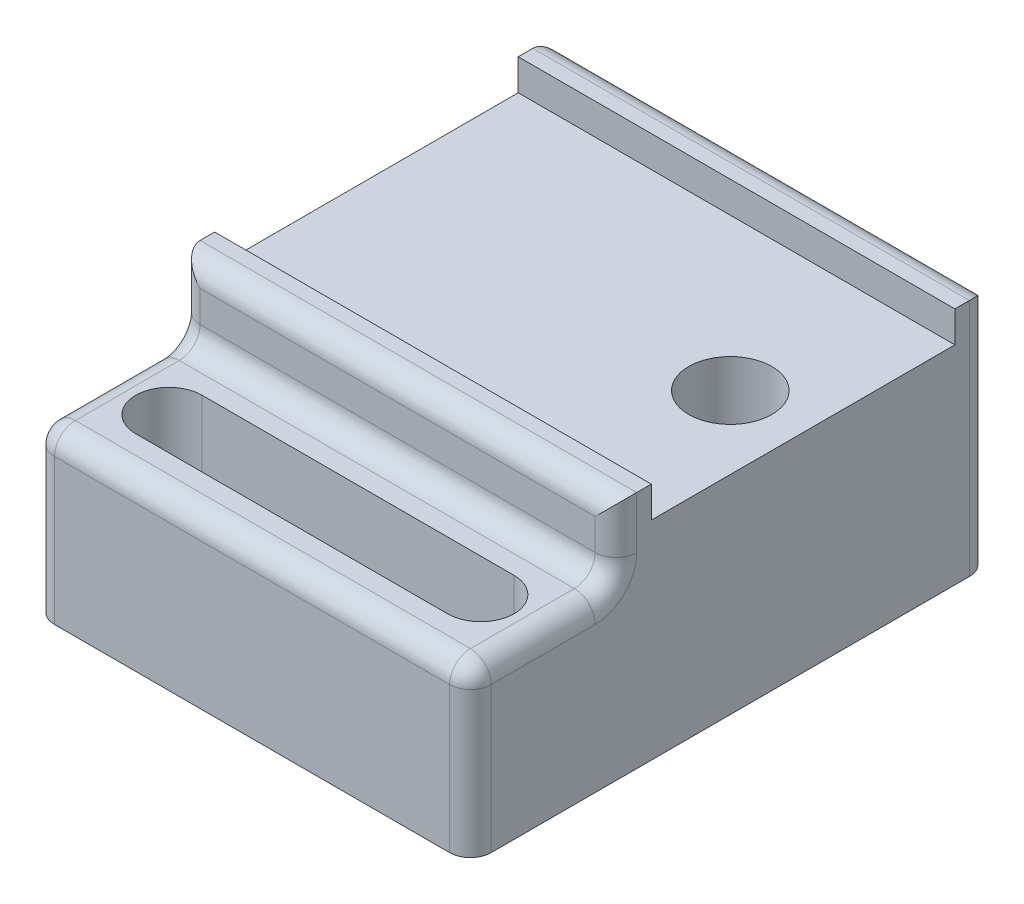
ISO-10303-21;
HEADER;
FILE_DESCRIPTION(('STEP AP214'),'2;1');
FILE_NAME('part.step','',(''),(''),'','','');
FILE_SCHEMA(('AUTOMOTIVE_DESIGN { 1 0 10303 214 1 1 1 1 }'));
ENDSEC;
DATA;
#1=APPLICATION_CONTEXT('core data for automotive mechanical design processes');
#2=APPLICATION_PROTOCOL_DEFINITION('international standard','automotive_design',2000,#1);
#3=PRODUCT_CONTEXT('',#1,'mechanical');
#4=PRODUCT('Part','Part','',(#3));
#5=PRODUCT_RELATED_PRODUCT_CATEGORY('part','',(#4));
#6=PRODUCT_DEFINITION_FORMATION('','',#4);
#7=PRODUCT_DEFINITION_CONTEXT('part definition',#1,'design');
#8=PRODUCT_DEFINITION('design','',#6,#7);
#9=PRODUCT_DEFINITION_SHAPE('','',#8);
#10=(LENGTH_UNIT() NAMED_UNIT(*) SI_UNIT(.MILLI.,.METRE.));
#11=(NAMED_UNIT(*) PLANE_ANGLE_UNIT() SI_UNIT($,.RADIAN.));
#12=(NAMED_UNIT(*) SI_UNIT($,.STERADIAN.) SOLID_ANGLE_UNIT());
#13=UNCERTAINTY_MEASURE_WITH_UNIT(LENGTH_MEASURE(1.E-05),#10,'distance_accuracy_value','');
#14=(GEOMETRIC_REPRESENTATION_CONTEXT(3) GLOBAL_UNCERTAINTY_ASSIGNED_CONTEXT((#13)) GLOBAL_UNIT_ASSIGNED_CONTEXT((#10,
#11,#12)) REPRESENTATION_CONTEXT('',''));
#15=CARTESIAN_POINT('',(0.,0.,0.));
#16=DIRECTION('',(0.,0.,1.));
#17=DIRECTION('',(1.,0.,0.));
#18=AXIS2_PLACEMENT_3D('',#15,#16,#17);
#19=CARTESIAN_POINT('',(0.,11.5,9.));
#20=DIRECTION('',(0.,0.,-1.));
#21=DIRECTION('',(-1.,0.,0.));
#22=AXIS2_PLACEMENT_3D('',#19,#20,#21);
#23=PLANE('',#22);
#24=DIRECTION('',(1.,0.,0.));
#25=VECTOR('',#24,1.);
#26=CARTESIAN_POINT('',(-10.5,10.5,9.));
#27=LINE('',#26,#25);
#28=CARTESIAN_POINT('',(9.5,10.5,9.));
#29=VERTEX_POINT('',#28);
#30=CARTESIAN_POINT('',(-9.5,10.5,9.));
#31=VERTEX_POINT('',#30);
#32=EDGE_CURVE('E309',#29,#31,#27,.F.);
#33=ORIENTED_EDGE('',*,*,#32,.T.);
#34=DIRECTION('',(0.,-1.,0.));
#35=VECTOR('',#34,1.);
#36=CARTESIAN_POINT('',(-9.5,11.5,9.));
#37=LINE('',#36,#35);
#38=CARTESIAN_POINT('',(-9.5,9.,9.));
#39=VERTEX_POINT('',#38);
#40=EDGE_CURVE('E311',#31,#39,#37,.T.);
#41=ORIENTED_EDGE('',*,*,#40,.T.);
#42=DIRECTION('',(-1.,0.,0.));
#43=VECTOR('',#42,1.);
#44=CARTESIAN_POINT('',(0.,9.,9.));
#45=LINE('',#44,#43);
#46=CARTESIAN_POINT('',(9.5,9.,9.));
#47=VERTEX_POINT('',#46);
#48=EDGE_CURVE('E305',#39,#47,#45,.F.);
#49=ORIENTED_EDGE('',*,*,#48,.T.);
#50=DIRECTION('',(0.,-1.,0.));
#51=VECTOR('',#50,1.);
#52=CARTESIAN_POINT('',(9.5,11.5,9.));
#53=LINE('',#52,#51);
#54=EDGE_CURVE('E307',#47,#29,#53,.F.);
#55=ORIENTED_EDGE('',*,*,#54,.T.);
#56=EDGE_LOOP('',(#33,#41,#49,#55));
#57=FACE_BOUND('',#56,.T.);
#58=ADVANCED_FACE('F35',(#57),#23,.F.);
#59=CARTESIAN_POINT('',(10.5,10.,0.));
#60=DIRECTION('',(1.,0.,0.));
#61=DIRECTION('',(0.,0.,-1.));
#62=AXIS2_PLACEMENT_3D('',#59,#60,#61);
#63=PLANE('',#62);
#64=DIRECTION('',(0.,0.,1.));
#65=VECTOR('',#64,1.);
#66=CARTESIAN_POINT('',(10.5,0.,0.));
#67=LINE('',#66,#65);
#68=CARTESIAN_POINT('',(10.5,0.,-8.));
#69=VERTEX_POINT('',#68);
#70=CARTESIAN_POINT('',(10.5,0.,15.));
#71=VERTEX_POINT('',#70);
#72=EDGE_CURVE('E266',#69,#71,#67,.T.);
#73=ORIENTED_EDGE('',*,*,#72,.F.);
#74=DIRECTION('',(0.,-1.,0.));
#75=VECTOR('',#74,1.);
#76=CARTESIAN_POINT('',(10.5,10.,-8.));
#77=LINE('',#76,#75);
#78=CARTESIAN_POINT('',(10.5,11.5,-8.));
#79=VERTEX_POINT('',#78);
#80=EDGE_CURVE('E303',#69,#79,#77,.F.);
#81=ORIENTED_EDGE('',*,*,#80,.T.);
#82=DIRECTION('',(0.,0.,1.));
#83=VECTOR('',#82,1.);
#84=CARTESIAN_POINT('',(10.5,11.5,0.));
#85=LINE('',#84,#83);
#86=CARTESIAN_POINT('',(10.5,11.5,-7.3));
#87=VERTEX_POINT('',#86);
#88=EDGE_CURVE('E237',#79,#87,#85,.T.);
#89=ORIENTED_EDGE('',*,*,#88,.T.);
#90=DIRECTION('',(0.,-1.,0.));
#91=VECTOR('',#90,1.);
#92=CARTESIAN_POINT('',(10.5,11.5,-7.3));
#93=LINE('',#92,#91);
#94=CARTESIAN_POINT('',(10.5,10.,-7.3));
#95=VERTEX_POINT('',#94);
#96=EDGE_CURVE('E244',#87,#95,#93,.T.);
#97=ORIENTED_EDGE('',*,*,#96,.T.);
#98=DIRECTION('',(0.,0.,1.));
#99=VECTOR('',#98,1.);
#100=CARTESIAN_POINT('',(10.5,10.,0.));
#101=LINE('',#100,#99);
#102=CARTESIAN_POINT('',(10.5,10.,7.3));
#103=VERTEX_POINT('',#102);
#104=EDGE_CURVE('E267',#95,#103,#101,.T.);
#105=ORIENTED_EDGE('',*,*,#104,.T.);
#106=DIRECTION('',(0.,-1.,0.));
#107=VECTOR('',#106,1.);
#108=CARTESIAN_POINT('',(10.5,11.5,7.3));
#109=LINE('',#108,#107);
#110=CARTESIAN_POINT('',(10.5,11.5,7.3));
#111=VERTEX_POINT('',#110);
#112=EDGE_CURVE('E264',#111,#103,#109,.T.);
#113=ORIENTED_EDGE('',*,*,#112,.F.);
#114=DIRECTION('',(0.,0.,1.));
#115=VECTOR('',#114,1.);
#116=CARTESIAN_POINT('',(10.5,11.5,0.));
#117=LINE('',#116,#115);
#118=CARTESIAN_POINT('',(10.5,11.5,8.));
#119=VERTEX_POINT('',#118);
#120=EDGE_CURVE('E252',#111,#119,#117,.T.);
#121=ORIENTED_EDGE('',*,*,#120,.T.);
#122=DIRECTION('',(0.,-1.,0.));
#123=VECTOR('',#122,1.);
#124=CARTESIAN_POINT('',(10.5,8.,8.));
#125=LINE('',#124,#123);
#126=CARTESIAN_POINT('',(10.5,9.,8.));
#127=VERTEX_POINT('',#126);
#128=EDGE_CURVE('E296',#119,#127,#125,.T.);
#129=ORIENTED_EDGE('',*,*,#128,.T.);
#130=CARTESIAN_POINT('',(10.5,9.,10.));
#131=DIRECTION('',(1.,0.,0.));
#132=DIRECTION('',(0.,0.,-1.));
#133=AXIS2_PLACEMENT_3D('',#130,#131,#132);
#134=CIRCLE('',#133,2.);
#135=CARTESIAN_POINT('',(10.5,7.,10.));
#136=VERTEX_POINT('',#135);
#137=EDGE_CURVE('E293',#136,#127,#134,.T.);
#138=ORIENTED_EDGE('',*,*,#137,.F.);
#139=DIRECTION('',(0.,0.,-1.));
#140=VECTOR('',#139,1.);
#141=CARTESIAN_POINT('',(10.5,7.,0.));
#142=LINE('',#141,#140);
#143=CARTESIAN_POINT('',(10.5,7.,15.));
#144=VERTEX_POINT('',#143);
#145=EDGE_CURVE('E298',#136,#144,#142,.F.);
#146=ORIENTED_EDGE('',*,*,#145,.T.);
#147=DIRECTION('',(0.,-1.,0.));
#148=VECTOR('',#147,1.);
#149=CARTESIAN_POINT('',(10.5,0.,15.));
#150=LINE('',#149,#148);
#151=EDGE_CURVE('E301',#144,#71,#150,.T.);
#152=ORIENTED_EDGE('',*,*,#151,.T.);
#153=EDGE_LOOP('',(#73,#81,#89,#97,#105,#113,#121,#129,#138,#146,#152));
#154=FACE_BOUND('',#153,.T.);
#155=ADVANCED_FACE('F442',(#154),#63,.T.);
#156=CARTESIAN_POINT('',(-10.5,10.,0.));
#157=DIRECTION('',(1.,0.,0.));
#158=DIRECTION('',(0.,0.,-1.));
#159=AXIS2_PLACEMENT_3D('',#156,#157,#158);
#160=PLANE('',#159);
#161=DIRECTION('',(0.,0.,1.));
#162=VECTOR('',#161,1.);
#163=CARTESIAN_POINT('',(-10.5,11.5,0.));
#164=LINE('',#163,#162);
#165=CARTESIAN_POINT('',(-10.5,11.5,-8.));
#166=VERTEX_POINT('',#165);
#167=CARTESIAN_POINT('',(-10.5,11.5,-7.3));
#168=VERTEX_POINT('',#167);
#169=EDGE_CURVE('E239',#166,#168,#164,.T.);
#170=ORIENTED_EDGE('',*,*,#169,.F.);
#171=DIRECTION('',(0.,-1.,0.));
#172=VECTOR('',#171,1.);
#173=CARTESIAN_POINT('',(-10.5,0.,-8.));
#174=LINE('',#173,#172);
#175=CARTESIAN_POINT('',(-10.5,0.,-8.));
#176=VERTEX_POINT('',#175);
#177=EDGE_CURVE('E323',#166,#176,#174,.T.);
#178=ORIENTED_EDGE('',*,*,#177,.T.);
#179=DIRECTION('',(0.,0.,1.));
#180=VECTOR('',#179,1.);
#181=CARTESIAN_POINT('',(-10.5,0.,0.));
#182=LINE('',#181,#180);
#183=CARTESIAN_POINT('',(-10.5,0.,15.));
#184=VERTEX_POINT('',#183);
#185=EDGE_CURVE('E271',#176,#184,#182,.T.);
#186=ORIENTED_EDGE('',*,*,#185,.T.);
#187=DIRECTION('',(0.,-1.,0.));
#188=VECTOR('',#187,1.);
#189=CARTESIAN_POINT('',(-10.5,10.,15.));
#190=LINE('',#189,#188);
#191=CARTESIAN_POINT('',(-10.5,7.,15.));
#192=VERTEX_POINT('',#191);
#193=EDGE_CURVE('E319',#184,#192,#190,.F.);
#194=ORIENTED_EDGE('',*,*,#193,.T.);
#195=DIRECTION('',(0.,0.,1.));
#196=VECTOR('',#195,1.);
#197=CARTESIAN_POINT('',(-10.5,7.,9.));
#198=LINE('',#197,#196);
#199=CARTESIAN_POINT('',(-10.5,7.,10.));
#200=VERTEX_POINT('',#199);
#201=EDGE_CURVE('E317',#192,#200,#198,.F.);
#202=ORIENTED_EDGE('',*,*,#201,.T.);
#203=CARTESIAN_POINT('',(-10.5,9.,10.));
#204=DIRECTION('',(1.,0.,0.));
#205=DIRECTION('',(0.,0.,-1.));
#206=AXIS2_PLACEMENT_3D('',#203,#204,#205);
#207=CIRCLE('',#206,2.);
#208=CARTESIAN_POINT('',(-10.5,9.,8.));
#209=VERTEX_POINT('',#208);
#210=EDGE_CURVE('E314',#209,#200,#207,.F.);
#211=ORIENTED_EDGE('',*,*,#210,.F.);
#212=DIRECTION('',(0.,-1.,0.));
#213=VECTOR('',#212,1.);
#214=CARTESIAN_POINT('',(-10.5,10.,8.));
#215=LINE('',#214,#213);
#216=CARTESIAN_POINT('',(-10.5,11.5,8.));
#217=VERTEX_POINT('',#216);
#218=EDGE_CURVE('E321',#209,#217,#215,.F.);
#219=ORIENTED_EDGE('',*,*,#218,.T.);
#220=DIRECTION('',(0.,0.,1.));
#221=VECTOR('',#220,1.);
#222=CARTESIAN_POINT('',(-10.5,11.5,0.));
#223=LINE('',#222,#221);
#224=CARTESIAN_POINT('',(-10.5,11.5,7.3));
#225=VERTEX_POINT('',#224);
#226=EDGE_CURVE('E258',#225,#217,#223,.T.);
#227=ORIENTED_EDGE('',*,*,#226,.F.);
#228=DIRECTION('',(0.,-1.,0.));
#229=VECTOR('',#228,1.);
#230=CARTESIAN_POINT('',(-10.5,11.5,7.3));
#231=LINE('',#230,#229);
#232=CARTESIAN_POINT('',(-10.5,10.,7.3));
#233=VERTEX_POINT('',#232);
#234=EDGE_CURVE('E261',#225,#233,#231,.T.);
#235=ORIENTED_EDGE('',*,*,#234,.T.);
#236=DIRECTION('',(0.,0.,1.));
#237=VECTOR('',#236,1.);
#238=CARTESIAN_POINT('',(-10.5,10.,0.));
#239=LINE('',#238,#237);
#240=CARTESIAN_POINT('',(-10.5,10.,-7.3));
#241=VERTEX_POINT('',#240);
#242=EDGE_CURVE('E274',#241,#233,#239,.T.);
#243=ORIENTED_EDGE('',*,*,#242,.F.);
#244=DIRECTION('',(0.,-1.,0.));
#245=VECTOR('',#244,1.);
#246=CARTESIAN_POINT('',(-10.5,11.5,-7.3));
#247=LINE('',#246,#245);
#248=EDGE_CURVE('E249',#168,#241,#247,.T.);
#249=ORIENTED_EDGE('',*,*,#248,.F.);
#250=EDGE_LOOP('',(#170,#178,#186,#194,#202,#211,#219,#227,#235,#243,#249));
#251=FACE_BOUND('',#250,.T.);
#252=ADVANCED_FACE('F403',(#251),#160,.F.);
#253=CARTESIAN_POINT('',(0.,10.,0.));
#254=DIRECTION('',(0.,1.,0.));
#255=DIRECTION('',(0.,0.,1.));
#256=AXIS2_PLACEMENT_3D('',#253,#254,#255);
#257=PLANE('',#256);
#258=CARTESIAN_POINT('',(7.,10.,0.));
#259=DIRECTION('',(0.,1.,0.));
#260=DIRECTION('',(0.,0.,1.));
#261=AXIS2_PLACEMENT_3D('',#258,#259,#260);
#262=CIRCLE('',#261,2.);
#263=CARTESIAN_POINT('',(7.,10.,2.));
#264=VERTEX_POINT('',#263);
#265=EDGE_CURVE('E215',#264,#264,#262,.T.);
#266=ORIENTED_EDGE('',*,*,#265,.F.);
#267=EDGE_LOOP('',(#266));
#268=FACE_BOUND('',#267,.T.);
#269=ORIENTED_EDGE('',*,*,#104,.F.);
#270=DIRECTION('',(1.,0.,0.));
#271=VECTOR('',#270,1.);
#272=CARTESIAN_POINT('',(0.,10.,-7.3));
#273=LINE('',#272,#271);
#274=EDGE_CURVE('E270',#241,#95,#273,.T.);
#275=ORIENTED_EDGE('',*,*,#274,.F.);
#276=ORIENTED_EDGE('',*,*,#242,.T.);
#277=DIRECTION('',(1.,0.,0.));
#278=VECTOR('',#277,1.);
#279=CARTESIAN_POINT('',(0.,10.,7.3));
#280=LINE('',#279,#278);
#281=EDGE_CURVE('E277',#233,#103,#280,.T.);
#282=ORIENTED_EDGE('',*,*,#281,.T.);
#283=EDGE_LOOP('',(#269,#275,#276,#282));
#284=FACE_BOUND('',#283,.T.);
#285=ADVANCED_FACE('F447',(#268,#284),#257,.T.);
#286=CARTESIAN_POINT('',(0.,0.,0.));
#287=DIRECTION('',(0.,1.,0.));
#288=DIRECTION('',(0.,0.,1.));
#289=AXIS2_PLACEMENT_3D('',#286,#287,#288);
#290=PLANE('',#289);
#291=DIRECTION('',(-1.,0.,0.));
#292=VECTOR('',#291,1.);
#293=CARTESIAN_POINT('',(-7.5,0.,10.9));
#294=LINE('',#293,#292);
#295=CARTESIAN_POINT('',(7.5,0.,10.9));
#296=VERTEX_POINT('',#295);
#297=CARTESIAN_POINT('',(-7.5,0.,10.9));
#298=VERTEX_POINT('',#297);
#299=EDGE_CURVE('E199',#296,#298,#294,.T.);
#300=ORIENTED_EDGE('',*,*,#299,.T.);
#301=CARTESIAN_POINT('',(-7.5,0.,12.5));
#302=DIRECTION('',(0.,1.,0.));
#303=DIRECTION('',(0.,0.,1.));
#304=AXIS2_PLACEMENT_3D('',#301,#302,#303);
#305=CIRCLE('',#304,1.6);
#306=CARTESIAN_POINT('',(-7.5,0.,14.1));
#307=VERTEX_POINT('',#306);
#308=EDGE_CURVE('E193',#298,#307,#305,.T.);
#309=ORIENTED_EDGE('',*,*,#308,.T.);
#310=DIRECTION('',(1.,0.,0.));
#311=VECTOR('',#310,1.);
#312=CARTESIAN_POINT('',(-7.5,0.,14.1));
#313=LINE('',#312,#311);
#314=CARTESIAN_POINT('',(7.5,0.,14.1));
#315=VERTEX_POINT('',#314);
#316=EDGE_CURVE('E202',#307,#315,#313,.T.);
#317=ORIENTED_EDGE('',*,*,#316,.T.);
#318=CARTESIAN_POINT('',(7.5,0.,12.5));
#319=DIRECTION('',(0.,1.,0.));
#320=DIRECTION('',(0.,0.,1.));
#321=AXIS2_PLACEMENT_3D('',#318,#319,#320);
#322=CIRCLE('',#321,1.6);
#323=EDGE_CURVE('E52',#315,#296,#322,.T.);
#324=ORIENTED_EDGE('',*,*,#323,.T.);
#325=EDGE_LOOP('',(#300,#309,#317,#324));
#326=FACE_BOUND('',#325,.T.);
#327=DIRECTION('',(1.,0.,0.));
#328=VECTOR('',#327,1.);
#329=CARTESIAN_POINT('',(0.,0.,-9.));
#330=LINE('',#329,#328);
#331=CARTESIAN_POINT('',(-9.5,0.,-9.));
#332=VERTEX_POINT('',#331);
#333=CARTESIAN_POINT('',(9.5,0.,-9.));
#334=VERTEX_POINT('',#333);
#335=EDGE_CURVE('E235',#332,#334,#330,.T.);
#336=ORIENTED_EDGE('',*,*,#335,.T.);
#337=CARTESIAN_POINT('',(9.5,0.,-8.));
#338=DIRECTION('',(0.,1.,0.));
#339=DIRECTION('',(0.,0.,1.));
#340=AXIS2_PLACEMENT_3D('',#337,#338,#339);
#341=CIRCLE('',#340,1.);
#342=EDGE_CURVE('E338',#334,#69,#341,.F.);
#343=ORIENTED_EDGE('',*,*,#342,.T.);
#344=ORIENTED_EDGE('',*,*,#72,.T.);
#345=CARTESIAN_POINT('',(9.5,0.,15.));
#346=DIRECTION('',(0.,1.,0.));
#347=DIRECTION('',(0.,0.,1.));
#348=AXIS2_PLACEMENT_3D('',#345,#346,#347);
#349=CIRCLE('',#348,1.);
#350=CARTESIAN_POINT('',(9.5,0.,16.));
#351=VERTEX_POINT('',#350);
#352=EDGE_CURVE('E332',#71,#351,#349,.F.);
#353=ORIENTED_EDGE('',*,*,#352,.T.);
#354=DIRECTION('',(1.,0.,0.));
#355=VECTOR('',#354,1.);
#356=CARTESIAN_POINT('',(-10.5,0.,16.));
#357=LINE('',#356,#355);
#358=CARTESIAN_POINT('',(-9.5,0.,16.));
#359=VERTEX_POINT('',#358);
#360=EDGE_CURVE('E232',#359,#351,#357,.T.);
#361=ORIENTED_EDGE('',*,*,#360,.F.);
#362=CARTESIAN_POINT('',(-9.5,0.,15.));
#363=DIRECTION('',(0.,1.,0.));
#364=DIRECTION('',(0.,0.,1.));
#365=AXIS2_PLACEMENT_3D('',#362,#363,#364);
#366=CIRCLE('',#365,1.);
#367=EDGE_CURVE('E334',#359,#184,#366,.F.);
#368=ORIENTED_EDGE('',*,*,#367,.T.);
#369=ORIENTED_EDGE('',*,*,#185,.F.);
#370=CARTESIAN_POINT('',(-9.5,0.,-8.));
#371=DIRECTION('',(0.,1.,0.));
#372=DIRECTION('',(0.,0.,1.));
#373=AXIS2_PLACEMENT_3D('',#370,#371,#372);
#374=CIRCLE('',#373,1.);
#375=EDGE_CURVE('E336',#176,#332,#374,.F.);
#376=ORIENTED_EDGE('',*,*,#375,.T.);
#377=EDGE_LOOP('',(#336,#343,#344,#353,#361,#368,#369,#376));
#378=FACE_BOUND('',#377,.T.);
#379=ADVANCED_FACE('F206',(#326,#378),#290,.F.);
#380=CARTESIAN_POINT('',(0.,11.5,7.3));
#381=DIRECTION('',(0.,0.,-1.));
#382=DIRECTION('',(-1.,0.,0.));
#383=AXIS2_PLACEMENT_3D('',#380,#381,#382);
#384=PLANE('',#383);
#385=ORIENTED_EDGE('',*,*,#281,.F.);
#386=ORIENTED_EDGE('',*,*,#234,.F.);
#387=DIRECTION('',(1.,0.,0.));
#388=VECTOR('',#387,1.);
#389=CARTESIAN_POINT('',(0.,11.5,7.3));
#390=LINE('',#389,#388);
#391=EDGE_CURVE('E255',#225,#111,#390,.T.);
#392=ORIENTED_EDGE('',*,*,#391,.T.);
#393=ORIENTED_EDGE('',*,*,#112,.T.);
#394=EDGE_LOOP('',(#385,#386,#392,#393));
#395=FACE_BOUND('',#394,.T.);
#396=ADVANCED_FACE('F445',(#395),#384,.T.);
#397=CARTESIAN_POINT('',(0.,11.5,0.));
#398=DIRECTION('',(0.,1.,0.));
#399=DIRECTION('',(0.,0.,1.));
#400=AXIS2_PLACEMENT_3D('',#397,#398,#399);
#401=PLANE('',#400);
#402=ORIENTED_EDGE('',*,*,#226,.T.);
#403=DIRECTION('',(1.,0.,0.));
#404=VECTOR('',#403,1.);
#405=CARTESIAN_POINT('',(10.5,11.5,8.));
#406=LINE('',#405,#404);
#407=EDGE_CURVE('E340',#217,#119,#406,.T.);
#408=ORIENTED_EDGE('',*,*,#407,.T.);
#409=ORIENTED_EDGE('',*,*,#120,.F.);
#410=ORIENTED_EDGE('',*,*,#391,.F.);
#411=EDGE_LOOP('',(#402,#408,#409,#410));
#412=FACE_BOUND('',#411,.T.);
#413=ADVANCED_FACE('F438',(#412),#401,.T.);
#414=CARTESIAN_POINT('',(0.,11.5,-7.3));
#415=DIRECTION('',(0.,0.,-1.));
#416=DIRECTION('',(-1.,0.,0.));
#417=AXIS2_PLACEMENT_3D('',#414,#415,#416);
#418=PLANE('',#417);
#419=ORIENTED_EDGE('',*,*,#248,.T.);
#420=ORIENTED_EDGE('',*,*,#274,.T.);
#421=ORIENTED_EDGE('',*,*,#96,.F.);
#422=DIRECTION('',(1.,0.,0.));
#423=VECTOR('',#422,1.);
#424=CARTESIAN_POINT('',(0.,11.5,-7.3));
#425=LINE('',#424,#423);
#426=EDGE_CURVE('E241',#168,#87,#425,.T.);
#427=ORIENTED_EDGE('',*,*,#426,.F.);
#428=EDGE_LOOP('',(#419,#420,#421,#427));
#429=FACE_BOUND('',#428,.T.);
#430=ADVANCED_FACE('F452',(#429),#418,.F.);
#431=CARTESIAN_POINT('',(0.,11.5,-9.));
#432=DIRECTION('',(0.,0.,-1.));
#433=DIRECTION('',(-1.,0.,0.));
#434=AXIS2_PLACEMENT_3D('',#431,#432,#433);
#435=PLANE('',#434);
#436=DIRECTION('',(1.,0.,0.));
#437=VECTOR('',#436,1.);
#438=CARTESIAN_POINT('',(0.,10.5,-9.));
#439=LINE('',#438,#437);
#440=CARTESIAN_POINT('',(-9.5,10.5,-9.));
#441=VERTEX_POINT('',#440);
#442=CARTESIAN_POINT('',(9.5,10.5,-9.));
#443=VERTEX_POINT('',#442);
#444=EDGE_CURVE('E325',#441,#443,#439,.T.);
#445=ORIENTED_EDGE('',*,*,#444,.T.);
#446=DIRECTION('',(0.,-1.,0.));
#447=VECTOR('',#446,1.);
#448=CARTESIAN_POINT('',(9.5,11.5,-9.));
#449=LINE('',#448,#447);
#450=EDGE_CURVE('E329',#443,#334,#449,.T.);
#451=ORIENTED_EDGE('',*,*,#450,.T.);
#452=ORIENTED_EDGE('',*,*,#335,.F.);
#453=DIRECTION('',(0.,-1.,0.));
#454=VECTOR('',#453,1.);
#455=CARTESIAN_POINT('',(-9.5,11.5,-9.));
#456=LINE('',#455,#454);
#457=EDGE_CURVE('E327',#332,#441,#456,.F.);
#458=ORIENTED_EDGE('',*,*,#457,.T.);
#459=EDGE_LOOP('',(#445,#451,#452,#458));
#460=FACE_BOUND('',#459,.T.);
#461=ADVANCED_FACE('F458',(#460),#435,.T.);
#462=CARTESIAN_POINT('',(0.,11.5,0.));
#463=DIRECTION('',(0.,1.,0.));
#464=DIRECTION('',(0.,0.,1.));
#465=AXIS2_PLACEMENT_3D('',#462,#463,#464);
#466=PLANE('',#465);
#467=ORIENTED_EDGE('',*,*,#88,.F.);
#468=DIRECTION('',(1.,0.,0.));
#469=VECTOR('',#468,1.);
#470=CARTESIAN_POINT('',(0.,11.5,-8.));
#471=LINE('',#470,#469);
#472=EDGE_CURVE('E342',#79,#166,#471,.F.);
#473=ORIENTED_EDGE('',*,*,#472,.T.);
#474=ORIENTED_EDGE('',*,*,#169,.T.);
#475=ORIENTED_EDGE('',*,*,#426,.T.);
#476=EDGE_LOOP('',(#467,#473,#474,#475));
#477=FACE_BOUND('',#476,.T.);
#478=ADVANCED_FACE('F455',(#477),#466,.T.);
#479=CARTESIAN_POINT('',(-10.5,8.,16.));
#480=DIRECTION('',(0.,0.,-1.));
#481=DIRECTION('',(-1.,0.,0.));
#482=AXIS2_PLACEMENT_3D('',#479,#480,#481);
#483=PLANE('',#482);
#484=DIRECTION('',(1.,0.,0.));
#485=VECTOR('',#484,1.);
#486=CARTESIAN_POINT('',(-10.5,7.,16.));
#487=LINE('',#486,#485);
#488=CARTESIAN_POINT('',(9.5,7.,16.));
#489=VERTEX_POINT('',#488);
#490=CARTESIAN_POINT('',(-9.5,7.,16.));
#491=VERTEX_POINT('',#490);
#492=EDGE_CURVE('E344',#489,#491,#487,.F.);
#493=ORIENTED_EDGE('',*,*,#492,.T.);
#494=DIRECTION('',(0.,-1.,0.));
#495=VECTOR('',#494,1.);
#496=CARTESIAN_POINT('',(-9.5,8.,16.));
#497=LINE('',#496,#495);
#498=EDGE_CURVE('E11',#491,#359,#497,.T.);
#499=ORIENTED_EDGE('',*,*,#498,.T.);
#500=ORIENTED_EDGE('',*,*,#360,.T.);
#501=DIRECTION('',(0.,-1.,0.));
#502=VECTOR('',#501,1.);
#503=CARTESIAN_POINT('',(9.5,8.,16.));
#504=LINE('',#503,#502);
#505=EDGE_CURVE('E44',#351,#489,#504,.F.);
#506=ORIENTED_EDGE('',*,*,#505,.T.);
#507=EDGE_LOOP('',(#493,#499,#500,#506));
#508=FACE_BOUND('',#507,.T.);
#509=ADVANCED_FACE('F465',(#508),#483,.F.);
#510=CARTESIAN_POINT('',(0.,8.,0.));
#511=DIRECTION('',(0.,1.,0.));
#512=DIRECTION('',(0.,0.,1.));
#513=AXIS2_PLACEMENT_3D('',#510,#511,#512);
#514=PLANE('',#513);
#515=CARTESIAN_POINT('',(-7.5,8.,12.5));
#516=DIRECTION('',(0.,1.,0.));
#517=DIRECTION('',(0.,0.,1.));
#518=AXIS2_PLACEMENT_3D('',#515,#516,#517);
#519=CIRCLE('',#518,1.6);
#520=CARTESIAN_POINT('',(-7.5,8.,10.9));
#521=VERTEX_POINT('',#520);
#522=CARTESIAN_POINT('',(-7.5,8.,14.1));
#523=VERTEX_POINT('',#522);
#524=EDGE_CURVE('E60',#521,#523,#519,.T.);
#525=ORIENTED_EDGE('',*,*,#524,.F.);
#526=DIRECTION('',(-1.,0.,0.));
#527=VECTOR('',#526,1.);
#528=CARTESIAN_POINT('',(-7.5,8.,10.9));
#529=LINE('',#528,#527);
#530=CARTESIAN_POINT('',(7.5,8.,10.9));
#531=VERTEX_POINT('',#530);
#532=EDGE_CURVE('E209',#531,#521,#529,.T.);
#533=ORIENTED_EDGE('',*,*,#532,.F.);
#534=CARTESIAN_POINT('',(7.5,8.,12.5));
#535=DIRECTION('',(0.,1.,0.));
#536=DIRECTION('',(0.,0.,1.));
#537=AXIS2_PLACEMENT_3D('',#534,#535,#536);
#538=CIRCLE('',#537,1.6);
#539=CARTESIAN_POINT('',(7.5,8.,14.1));
#540=VERTEX_POINT('',#539);
#541=EDGE_CURVE('E212',#540,#531,#538,.T.);
#542=ORIENTED_EDGE('',*,*,#541,.F.);
#543=DIRECTION('',(1.,0.,0.));
#544=VECTOR('',#543,1.);
#545=CARTESIAN_POINT('',(-7.5,8.,14.1));
#546=LINE('',#545,#544);
#547=EDGE_CURVE('E221',#523,#540,#546,.T.);
#548=ORIENTED_EDGE('',*,*,#547,.F.);
#549=EDGE_LOOP('',(#525,#533,#542,#548));
#550=FACE_BOUND('',#549,.T.);
#551=DIRECTION('',(1.,0.,0.));
#552=VECTOR('',#551,1.);
#553=CARTESIAN_POINT('',(10.5,8.,15.));
#554=LINE('',#553,#552);
#555=CARTESIAN_POINT('',(-9.5,8.,15.));
#556=VERTEX_POINT('',#555);
#557=CARTESIAN_POINT('',(9.5,8.,15.));
#558=VERTEX_POINT('',#557);
#559=EDGE_CURVE('E288',#556,#558,#554,.T.);
#560=ORIENTED_EDGE('',*,*,#559,.T.);
#561=DIRECTION('',(0.,0.,-1.));
#562=VECTOR('',#561,1.);
#563=CARTESIAN_POINT('',(9.5,8.,0.));
#564=LINE('',#563,#562);
#565=CARTESIAN_POINT('',(9.5,8.,10.));
#566=VERTEX_POINT('',#565);
#567=EDGE_CURVE('E290',#558,#566,#564,.T.);
#568=ORIENTED_EDGE('',*,*,#567,.T.);
#569=DIRECTION('',(-1.,0.,0.));
#570=VECTOR('',#569,1.);
#571=CARTESIAN_POINT('',(0.,8.,10.));
#572=LINE('',#571,#570);
#573=CARTESIAN_POINT('',(-9.5,8.,10.));
#574=VERTEX_POINT('',#573);
#575=EDGE_CURVE('E280',#566,#574,#572,.T.);
#576=ORIENTED_EDGE('',*,*,#575,.T.);
#577=DIRECTION('',(0.,0.,1.));
#578=VECTOR('',#577,1.);
#579=CARTESIAN_POINT('',(-9.5,8.,16.));
#580=LINE('',#579,#578);
#581=EDGE_CURVE('E286',#574,#556,#580,.T.);
#582=ORIENTED_EDGE('',*,*,#581,.T.);
#583=EDGE_LOOP('',(#560,#568,#576,#582));
#584=FACE_BOUND('',#583,.T.);
#585=ADVANCED_FACE('F528',(#550,#584),#514,.T.);
#586=CARTESIAN_POINT('',(-9.5,8.,15.));
#587=DIRECTION('',(0.,-1.,0.));
#588=DIRECTION('',(0.,0.,-1.));
#589=AXIS2_PLACEMENT_3D('',#586,#587,#588);
#590=CYLINDRICAL_SURFACE('',#589,1.);
#591=ORIENTED_EDGE('',*,*,#367,.F.);
#592=ORIENTED_EDGE('',*,*,#498,.F.);
#593=CARTESIAN_POINT('',(-9.5,7.,15.));
#594=DIRECTION('',(0.,1.,0.));
#595=DIRECTION('',(0.,0.,1.));
#596=AXIS2_PLACEMENT_3D('',#593,#594,#595);
#597=CIRCLE('',#596,1.);
#598=EDGE_CURVE('E236',#192,#491,#597,.T.);
#599=ORIENTED_EDGE('',*,*,#598,.F.);
#600=ORIENTED_EDGE('',*,*,#193,.F.);
#601=EDGE_LOOP('',(#591,#592,#599,#600));
#602=FACE_BOUND('',#601,.T.);
#603=ADVANCED_FACE('F411',(#602),#590,.T.);
#604=CARTESIAN_POINT('',(-9.5,7.,0.));
#605=DIRECTION('',(0.,0.,-1.));
#606=DIRECTION('',(-1.,0.,0.));
#607=AXIS2_PLACEMENT_3D('',#604,#605,#606);
#608=CYLINDRICAL_SURFACE('',#607,1.);
#609=CARTESIAN_POINT('',(-9.5,7.,10.));
#610=DIRECTION('',(0.,0.,-1.));
#611=DIRECTION('',(-1.,0.,0.));
#612=AXIS2_PLACEMENT_3D('',#609,#610,#611);
#613=CIRCLE('',#612,1.);
#614=EDGE_CURVE('E378',#200,#574,#613,.T.);
#615=ORIENTED_EDGE('',*,*,#614,.F.);
#616=ORIENTED_EDGE('',*,*,#201,.F.);
#617=CARTESIAN_POINT('',(-9.5,7.,15.));
#618=DIRECTION('',(0.,0.,1.));
#619=DIRECTION('',(1.,0.,0.));
#620=AXIS2_PLACEMENT_3D('',#617,#618,#619);
#621=CIRCLE('',#620,1.);
#622=EDGE_CURVE('E381',#556,#192,#621,.T.);
#623=ORIENTED_EDGE('',*,*,#622,.F.);
#624=ORIENTED_EDGE('',*,*,#581,.F.);
#625=EDGE_LOOP('',(#615,#616,#623,#624));
#626=FACE_BOUND('',#625,.T.);
#627=ADVANCED_FACE('F417',(#626),#608,.T.);
#628=CARTESIAN_POINT('',(-9.5,11.5,8.));
#629=DIRECTION('',(0.,-1.,0.));
#630=DIRECTION('',(0.,0.,-1.));
#631=AXIS2_PLACEMENT_3D('',#628,#629,#630);
#632=CYLINDRICAL_SURFACE('',#631,1.);
#633=CARTESIAN_POINT('',(-9.5,10.5,8.));
#634=DIRECTION('',(-0.707106781186547,-0.707106781186547,0.));
#635=DIRECTION('',(-0.707106781186547,0.707106781186547,0.));
#636=AXIS2_PLACEMENT_3D('',#633,#634,#635);
#637=ELLIPSE('',#636,1.41421356237309,1.);
#638=EDGE_CURVE('E372',#217,#31,#637,.F.);
#639=ORIENTED_EDGE('',*,*,#638,.F.);
#640=ORIENTED_EDGE('',*,*,#218,.F.);
#641=CARTESIAN_POINT('',(-9.5,9.,8.));
#642=DIRECTION('',(0.,-1.,0.));
#643=DIRECTION('',(0.,0.,-1.));
#644=AXIS2_PLACEMENT_3D('',#641,#642,#643);
#645=CIRCLE('',#644,1.);
#646=EDGE_CURVE('E375',#39,#209,#645,.T.);
#647=ORIENTED_EDGE('',*,*,#646,.F.);
#648=ORIENTED_EDGE('',*,*,#40,.F.);
#649=EDGE_LOOP('',(#639,#640,#647,#648));
#650=FACE_BOUND('',#649,.T.);
#651=ADVANCED_FACE('F428',(#650),#632,.T.);
#652=CARTESIAN_POINT('',(-9.5,7.,15.));
#653=DIRECTION('',(-1.,0.,0.));
#654=DIRECTION('',(0.,0.,1.));
#655=AXIS2_PLACEMENT_3D('',#652,#653,#654);
#656=SPHERICAL_SURFACE('',#655,1.);
#657=ORIENTED_EDGE('',*,*,#622,.T.);
#658=ORIENTED_EDGE('',*,*,#598,.T.);
#659=CARTESIAN_POINT('',(-9.5,7.,15.));
#660=DIRECTION('',(-1.,0.,0.));
#661=DIRECTION('',(0.,0.,1.));
#662=AXIS2_PLACEMENT_3D('',#659,#660,#661);
#663=CIRCLE('',#662,1.);
#664=EDGE_CURVE('E369',#556,#491,#663,.F.);
#665=ORIENTED_EDGE('',*,*,#664,.F.);
#666=EDGE_LOOP('',(#657,#658,#665));
#667=FACE_BOUND('',#666,.T.);
#668=ADVANCED_FACE('F518',(#667),#656,.T.);
#669=CARTESIAN_POINT('',(-9.5,9.,10.));
#670=DIRECTION('',(1.,0.,0.));
#671=DIRECTION('',(0.,0.,-1.));
#672=AXIS2_PLACEMENT_3D('',#669,#670,#671);
#673=TOROIDAL_SURFACE('',#672,2.,1.);
#674=ORIENTED_EDGE('',*,*,#210,.T.);
#675=ORIENTED_EDGE('',*,*,#614,.T.);
#676=CARTESIAN_POINT('',(-9.5,9.,10.));
#677=DIRECTION('',(1.,0.,0.));
#678=DIRECTION('',(0.,0.,-1.));
#679=AXIS2_PLACEMENT_3D('',#676,#677,#678);
#680=CIRCLE('',#679,1.);
#681=EDGE_CURVE('E366',#39,#574,#680,.F.);
#682=ORIENTED_EDGE('',*,*,#681,.F.);
#683=ORIENTED_EDGE('',*,*,#646,.T.);
#684=EDGE_LOOP('',(#674,#675,#682,#683));
#685=FACE_BOUND('',#684,.T.);
#686=ADVANCED_FACE('F422',(#685),#673,.T.);
#687=CARTESIAN_POINT('',(0.,10.5,8.));
#688=DIRECTION('',(-1.,0.,0.));
#689=DIRECTION('',(0.,0.,1.));
#690=AXIS2_PLACEMENT_3D('',#687,#688,#689);
#691=CYLINDRICAL_SURFACE('',#690,1.);
#692=ORIENTED_EDGE('',*,*,#638,.T.);
#693=ORIENTED_EDGE('',*,*,#32,.F.);
#694=CARTESIAN_POINT('',(9.5,10.5,8.));
#695=DIRECTION('',(-0.707106781186547,0.707106781186547,0.));
#696=DIRECTION('',(0.707106781186547,0.707106781186547,0.));
#697=AXIS2_PLACEMENT_3D('',#694,#695,#696);
#698=ELLIPSE('',#697,1.41421356237309,1.);
#699=EDGE_CURVE('E363',#119,#29,#698,.F.);
#700=ORIENTED_EDGE('',*,*,#699,.F.);
#701=ORIENTED_EDGE('',*,*,#407,.F.);
#702=EDGE_LOOP('',(#692,#693,#700,#701));
#703=FACE_BOUND('',#702,.T.);
#704=ADVANCED_FACE('F434',(#703),#691,.T.);
#705=CARTESIAN_POINT('',(9.5,10.,15.));
#706=DIRECTION('',(0.,1.,0.));
#707=DIRECTION('',(0.,0.,1.));
#708=AXIS2_PLACEMENT_3D('',#705,#706,#707);
#709=CYLINDRICAL_SURFACE('',#708,1.);
#710=ORIENTED_EDGE('',*,*,#352,.F.);
#711=ORIENTED_EDGE('',*,*,#151,.F.);
#712=CARTESIAN_POINT('',(9.5,7.,15.));
#713=DIRECTION('',(0.,1.,0.));
#714=DIRECTION('',(0.,0.,1.));
#715=AXIS2_PLACEMENT_3D('',#712,#713,#714);
#716=CIRCLE('',#715,1.);
#717=EDGE_CURVE('E360',#489,#144,#716,.T.);
#718=ORIENTED_EDGE('',*,*,#717,.F.);
#719=ORIENTED_EDGE('',*,*,#505,.F.);
#720=EDGE_LOOP('',(#710,#711,#718,#719));
#721=FACE_BOUND('',#720,.T.);
#722=ADVANCED_FACE('F509',(#721),#709,.T.);
#723=CARTESIAN_POINT('',(0.,7.,15.));
#724=DIRECTION('',(-1.,0.,0.));
#725=DIRECTION('',(0.,0.,1.));
#726=AXIS2_PLACEMENT_3D('',#723,#724,#725);
#727=CYLINDRICAL_SURFACE('',#726,1.);
#728=ORIENTED_EDGE('',*,*,#664,.T.);
#729=ORIENTED_EDGE('',*,*,#492,.F.);
#730=CARTESIAN_POINT('',(9.5,7.,15.));
#731=DIRECTION('',(1.,0.,0.));
#732=DIRECTION('',(0.,0.,-1.));
#733=AXIS2_PLACEMENT_3D('',#730,#731,#732);
#734=CIRCLE('',#733,1.);
#735=EDGE_CURVE('E357',#558,#489,#734,.T.);
#736=ORIENTED_EDGE('',*,*,#735,.F.);
#737=ORIENTED_EDGE('',*,*,#559,.F.);
#738=EDGE_LOOP('',(#728,#729,#736,#737));
#739=FACE_BOUND('',#738,.T.);
#740=ADVANCED_FACE('F505',(#739),#727,.T.);
#741=CARTESIAN_POINT('',(0.,9.,10.));
#742=DIRECTION('',(-1.,0.,0.));
#743=DIRECTION('',(0.,0.,1.));
#744=AXIS2_PLACEMENT_3D('',#741,#742,#743);
#745=CYLINDRICAL_SURFACE('',#744,1.);
#746=ORIENTED_EDGE('',*,*,#681,.T.);
#747=ORIENTED_EDGE('',*,*,#575,.F.);
#748=CARTESIAN_POINT('',(9.5,9.,10.));
#749=DIRECTION('',(1.,0.,0.));
#750=DIRECTION('',(0.,0.,-1.));
#751=AXIS2_PLACEMENT_3D('',#748,#749,#750);
#752=CIRCLE('',#751,1.);
#753=EDGE_CURVE('E354',#47,#566,#752,.F.);
#754=ORIENTED_EDGE('',*,*,#753,.F.);
#755=ORIENTED_EDGE('',*,*,#48,.F.);
#756=EDGE_LOOP('',(#746,#747,#754,#755));
#757=FACE_BOUND('',#756,.T.);
#758=ADVANCED_FACE('F501',(#757),#745,.F.);
#759=CARTESIAN_POINT('',(9.5,10.,8.));
#760=DIRECTION('',(0.,1.,0.));
#761=DIRECTION('',(0.,0.,1.));
#762=AXIS2_PLACEMENT_3D('',#759,#760,#761);
#763=CYLINDRICAL_SURFACE('',#762,1.);
#764=ORIENTED_EDGE('',*,*,#699,.T.);
#765=ORIENTED_EDGE('',*,*,#54,.F.);
#766=CARTESIAN_POINT('',(9.5,9.,8.));
#767=DIRECTION('',(0.,-1.,0.));
#768=DIRECTION('',(0.,0.,-1.));
#769=AXIS2_PLACEMENT_3D('',#766,#767,#768);
#770=CIRCLE('',#769,1.);
#771=EDGE_CURVE('E351',#127,#47,#770,.T.);
#772=ORIENTED_EDGE('',*,*,#771,.F.);
#773=ORIENTED_EDGE('',*,*,#128,.F.);
#774=EDGE_LOOP('',(#764,#765,#772,#773));
#775=FACE_BOUND('',#774,.T.);
#776=ADVANCED_FACE('F497',(#775),#763,.T.);
#777=CARTESIAN_POINT('',(9.5,7.,15.));
#778=DIRECTION('',(0.,0.,1.));
#779=DIRECTION('',(1.,0.,0.));
#780=AXIS2_PLACEMENT_3D('',#777,#778,#779);
#781=SPHERICAL_SURFACE('',#780,1.);
#782=ORIENTED_EDGE('',*,*,#735,.T.);
#783=ORIENTED_EDGE('',*,*,#717,.T.);
#784=CARTESIAN_POINT('',(9.5,7.,15.));
#785=DIRECTION('',(0.,0.,1.));
#786=DIRECTION('',(1.,0.,0.));
#787=AXIS2_PLACEMENT_3D('',#784,#785,#786);
#788=CIRCLE('',#787,1.);
#789=EDGE_CURVE('E349',#558,#144,#788,.F.);
#790=ORIENTED_EDGE('',*,*,#789,.F.);
#791=EDGE_LOOP('',(#782,#783,#790));
#792=FACE_BOUND('',#791,.T.);
#793=ADVANCED_FACE('F493',(#792),#781,.T.);
#794=CARTESIAN_POINT('',(9.5,9.,10.));
#795=DIRECTION('',(1.,0.,0.));
#796=DIRECTION('',(0.,0.,-1.));
#797=AXIS2_PLACEMENT_3D('',#794,#795,#796);
#798=TOROIDAL_SURFACE('',#797,2.,1.);
#799=ORIENTED_EDGE('',*,*,#771,.T.);
#800=ORIENTED_EDGE('',*,*,#753,.T.);
#801=CARTESIAN_POINT('',(9.5,7.,10.));
#802=DIRECTION('',(0.,0.,-1.));
#803=DIRECTION('',(-1.,0.,0.));
#804=AXIS2_PLACEMENT_3D('',#801,#802,#803);
#805=CIRCLE('',#804,1.);
#806=EDGE_CURVE('E347',#136,#566,#805,.F.);
#807=ORIENTED_EDGE('',*,*,#806,.F.);
#808=ORIENTED_EDGE('',*,*,#137,.T.);
#809=EDGE_LOOP('',(#799,#800,#807,#808));
#810=FACE_BOUND('',#809,.T.);
#811=ADVANCED_FACE('F489',(#810),#798,.T.);
#812=CARTESIAN_POINT('',(9.5,7.,0.));
#813=DIRECTION('',(0.,0.,-1.));
#814=DIRECTION('',(-1.,0.,0.));
#815=AXIS2_PLACEMENT_3D('',#812,#813,#814);
#816=CYLINDRICAL_SURFACE('',#815,1.);
#817=ORIENTED_EDGE('',*,*,#789,.T.);
#818=ORIENTED_EDGE('',*,*,#145,.F.);
#819=ORIENTED_EDGE('',*,*,#806,.T.);
#820=ORIENTED_EDGE('',*,*,#567,.F.);
#821=EDGE_LOOP('',(#817,#818,#819,#820));
#822=FACE_BOUND('',#821,.T.);
#823=ADVANCED_FACE('F486',(#822),#816,.T.);
#824=CARTESIAN_POINT('',(-9.5,10.,-8.));
#825=DIRECTION('',(0.,1.,0.));
#826=DIRECTION('',(0.,0.,1.));
#827=AXIS2_PLACEMENT_3D('',#824,#825,#826);
#828=CYLINDRICAL_SURFACE('',#827,1.);
#829=ORIENTED_EDGE('',*,*,#375,.F.);
#830=ORIENTED_EDGE('',*,*,#177,.F.);
#831=CARTESIAN_POINT('',(-9.5,10.5,-8.));
#832=DIRECTION('',(0.707106781186547,0.707106781186547,0.));
#833=DIRECTION('',(0.707106781186547,-0.707106781186547,0.));
#834=AXIS2_PLACEMENT_3D('',#831,#832,#833);
#835=ELLIPSE('',#834,1.41421356237309,1.);
#836=EDGE_CURVE('E39',#441,#166,#835,.T.);
#837=ORIENTED_EDGE('',*,*,#836,.F.);
#838=ORIENTED_EDGE('',*,*,#457,.F.);
#839=EDGE_LOOP('',(#829,#830,#837,#838));
#840=FACE_BOUND('',#839,.T.);
#841=ADVANCED_FACE('F37',(#840),#828,.T.);
#842=CARTESIAN_POINT('',(0.,10.5,-8.));
#843=DIRECTION('',(1.,0.,0.));
#844=DIRECTION('',(0.,0.,-1.));
#845=AXIS2_PLACEMENT_3D('',#842,#843,#844);
#846=CYLINDRICAL_SURFACE('',#845,1.);
#847=ORIENTED_EDGE('',*,*,#836,.T.);
#848=ORIENTED_EDGE('',*,*,#472,.F.);
#849=CARTESIAN_POINT('',(9.5,10.5,-8.));
#850=DIRECTION('',(0.707106781186547,-0.707106781186547,0.));
#851=DIRECTION('',(0.707106781186547,0.707106781186547,0.));
#852=AXIS2_PLACEMENT_3D('',#849,#850,#851);
#853=ELLIPSE('',#852,1.41421356237309,1.);
#854=EDGE_CURVE('E228',#443,#79,#853,.T.);
#855=ORIENTED_EDGE('',*,*,#854,.F.);
#856=ORIENTED_EDGE('',*,*,#444,.F.);
#857=EDGE_LOOP('',(#847,#848,#855,#856));
#858=FACE_BOUND('',#857,.T.);
#859=ADVANCED_FACE('F395',(#858),#846,.T.);
#860=CARTESIAN_POINT('',(9.5,11.5,-8.));
#861=DIRECTION('',(0.,-1.,0.));
#862=DIRECTION('',(0.,0.,-1.));
#863=AXIS2_PLACEMENT_3D('',#860,#861,#862);
#864=CYLINDRICAL_SURFACE('',#863,1.);
#865=ORIENTED_EDGE('',*,*,#854,.T.);
#866=ORIENTED_EDGE('',*,*,#80,.F.);
#867=ORIENTED_EDGE('',*,*,#342,.F.);
#868=ORIENTED_EDGE('',*,*,#450,.F.);
#869=EDGE_LOOP('',(#865,#866,#867,#868));
#870=FACE_BOUND('',#869,.T.);
#871=ADVANCED_FACE('F456',(#870),#864,.T.);
#872=CARTESIAN_POINT('',(-7.5,0.,12.5));
#873=DIRECTION('',(0.,1.,0.));
#874=DIRECTION('',(0.,0.,1.));
#875=AXIS2_PLACEMENT_3D('',#872,#873,#874);
#876=CYLINDRICAL_SURFACE('',#875,1.6);
#877=ORIENTED_EDGE('',*,*,#524,.T.);
#878=DIRECTION('',(0.,1.,0.));
#879=VECTOR('',#878,1.);
#880=CARTESIAN_POINT('',(-7.5,0.,14.1));
#881=LINE('',#880,#879);
#882=EDGE_CURVE('E189',#307,#523,#881,.T.);
#883=ORIENTED_EDGE('',*,*,#882,.F.);
#884=ORIENTED_EDGE('',*,*,#308,.F.);
#885=DIRECTION('',(0.,1.,0.));
#886=VECTOR('',#885,1.);
#887=CARTESIAN_POINT('',(-7.5,0.,10.9));
#888=LINE('',#887,#886);
#889=EDGE_CURVE('E226',#298,#521,#888,.T.);
#890=ORIENTED_EDGE('',*,*,#889,.T.);
#891=EDGE_LOOP('',(#877,#883,#884,#890));
#892=FACE_BOUND('',#891,.T.);
#893=ADVANCED_FACE('F191',(#892),#876,.F.);
#894=CARTESIAN_POINT('',(-7.5,0.,10.9));
#895=DIRECTION('',(0.,0.,-1.));
#896=DIRECTION('',(-1.,0.,0.));
#897=AXIS2_PLACEMENT_3D('',#894,#895,#896);
#898=PLANE('',#897);
#899=ORIENTED_EDGE('',*,*,#532,.T.);
#900=ORIENTED_EDGE('',*,*,#889,.F.);
#901=ORIENTED_EDGE('',*,*,#299,.F.);
#902=DIRECTION('',(0.,1.,0.));
#903=VECTOR('',#902,1.);
#904=CARTESIAN_POINT('',(7.5,0.,10.9));
#905=LINE('',#904,#903);
#906=EDGE_CURVE('E229',#296,#531,#905,.T.);
#907=ORIENTED_EDGE('',*,*,#906,.T.);
#908=EDGE_LOOP('',(#899,#900,#901,#907));
#909=FACE_BOUND('',#908,.T.);
#910=ADVANCED_FACE('F693',(#909),#898,.F.);
#911=CARTESIAN_POINT('',(7.5,0.,12.5));
#912=DIRECTION('',(0.,1.,0.));
#913=DIRECTION('',(0.,0.,1.));
#914=AXIS2_PLACEMENT_3D('',#911,#912,#913);
#915=CYLINDRICAL_SURFACE('',#914,1.6);
#916=ORIENTED_EDGE('',*,*,#541,.T.);
#917=ORIENTED_EDGE('',*,*,#906,.F.);
#918=ORIENTED_EDGE('',*,*,#323,.F.);
#919=DIRECTION('',(0.,1.,0.));
#920=VECTOR('',#919,1.);
#921=CARTESIAN_POINT('',(7.5,0.,14.1));
#922=LINE('',#921,#920);
#923=EDGE_CURVE('E198',#315,#540,#922,.T.);
#924=ORIENTED_EDGE('',*,*,#923,.T.);
#925=EDGE_LOOP('',(#916,#917,#918,#924));
#926=FACE_BOUND('',#925,.T.);
#927=ADVANCED_FACE('F696',(#926),#915,.F.);
#928=CARTESIAN_POINT('',(-7.5,0.,14.1));
#929=DIRECTION('',(0.,0.,1.));
#930=DIRECTION('',(1.,0.,0.));
#931=AXIS2_PLACEMENT_3D('',#928,#929,#930);
#932=PLANE('',#931);
#933=ORIENTED_EDGE('',*,*,#547,.T.);
#934=ORIENTED_EDGE('',*,*,#923,.F.);
#935=ORIENTED_EDGE('',*,*,#316,.F.);
#936=ORIENTED_EDGE('',*,*,#882,.T.);
#937=EDGE_LOOP('',(#933,#934,#935,#936));
#938=FACE_BOUND('',#937,.T.);
#939=ADVANCED_FACE('F203',(#938),#932,.F.);
#940=CARTESIAN_POINT('',(7.,3.2,0.));
#941=DIRECTION('',(0.,1.,0.));
#942=DIRECTION('',(0.,0.,1.));
#943=AXIS2_PLACEMENT_3D('',#940,#941,#942);
#944=CYLINDRICAL_SURFACE('',#943,2.);
#945=CARTESIAN_POINT('',(7.,3.2,0.));
#946=DIRECTION('',(0.,1.,0.));
#947=DIRECTION('',(0.,0.,1.));
#948=AXIS2_PLACEMENT_3D('',#945,#946,#947);
#949=CIRCLE('',#948,2.);
#950=CARTESIAN_POINT('',(7.,3.2,2.));
#951=VERTEX_POINT('',#950);
#952=EDGE_CURVE('E222',#951,#951,#949,.T.);
#953=ORIENTED_EDGE('',*,*,#952,.F.);
#954=EDGE_LOOP('',(#953));
#955=FACE_BOUND('',#954,.T.);
#956=ORIENTED_EDGE('',*,*,#265,.T.);
#957=EDGE_LOOP('',(#956));
#958=FACE_BOUND('',#957,.T.);
#959=ADVANCED_FACE('F672',(#955,#958),#944,.F.);
#960=CARTESIAN_POINT('',(7.,3.2,0.));
#961=DIRECTION('',(0.,1.,0.));
#962=DIRECTION('',(0.,0.,1.));
#963=AXIS2_PLACEMENT_3D('',#960,#961,#962);
#964=PLANE('',#963);
#965=ORIENTED_EDGE('',*,*,#952,.T.);
#966=EDGE_LOOP('',(#965));
#967=FACE_BOUND('',#966,.T.);
#968=ADVANCED_FACE('F677',(#967),#964,.T.);
#969=CLOSED_SHELL('',(#58,#155,#252,#285,#379,#396,#413,#430,#461,#478,#509,#585,#603,#627,#651,
#668,#686,#704,#722,#740,#758,#776,#793,#811,#823,#841,#859,#871,#893,#910,#927,#939,#959,#968));
#970=MANIFOLD_SOLID_BREP('B2',#969);
#971=ADVANCED_BREP_SHAPE_REPRESENTATION('',(#18,#970),#14);
#972=SHAPE_DEFINITION_REPRESENTATION(#9,#971);
ENDSEC;
END-ISO-10303-21;
